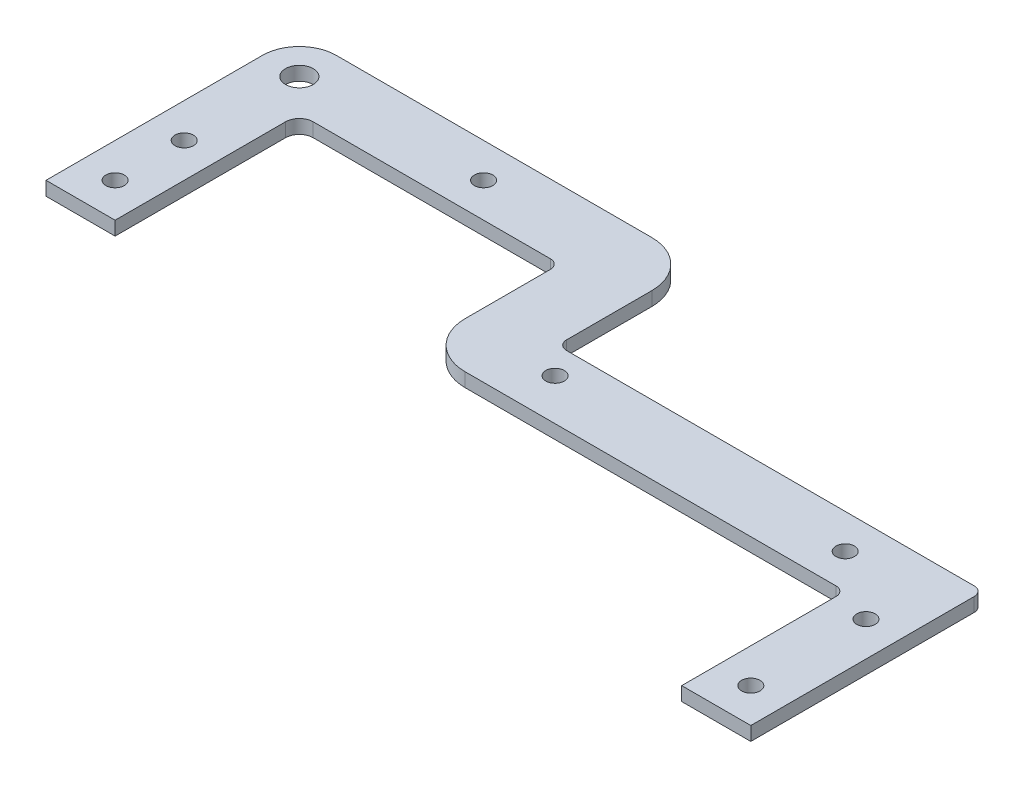
ISO-10303-21;
HEADER;
FILE_DESCRIPTION(('STEP AP214'),'2;1');
FILE_NAME('part.step','',(''),(''),'','','');
FILE_SCHEMA(('AUTOMOTIVE_DESIGN { 1 0 10303 214 1 1 1 1 }'));
ENDSEC;
DATA;
#1=APPLICATION_CONTEXT('core data for automotive mechanical design processes');
#2=APPLICATION_PROTOCOL_DEFINITION('international standard','automotive_design',2000,#1);
#3=PRODUCT_CONTEXT('',#1,'mechanical');
#4=PRODUCT('Part','Part','',(#3));
#5=PRODUCT_RELATED_PRODUCT_CATEGORY('part','',(#4));
#6=PRODUCT_DEFINITION_FORMATION('','',#4);
#7=PRODUCT_DEFINITION_CONTEXT('part definition',#1,'design');
#8=PRODUCT_DEFINITION('design','',#6,#7);
#9=PRODUCT_DEFINITION_SHAPE('','',#8);
#10=(LENGTH_UNIT() NAMED_UNIT(*) SI_UNIT(.MILLI.,.METRE.));
#11=(NAMED_UNIT(*) PLANE_ANGLE_UNIT() SI_UNIT($,.RADIAN.));
#12=(NAMED_UNIT(*) SI_UNIT($,.STERADIAN.) SOLID_ANGLE_UNIT());
#13=UNCERTAINTY_MEASURE_WITH_UNIT(LENGTH_MEASURE(1.E-05),#10,'distance_accuracy_value','');
#14=(GEOMETRIC_REPRESENTATION_CONTEXT(3) GLOBAL_UNCERTAINTY_ASSIGNED_CONTEXT((#13)) GLOBAL_UNIT_ASSIGNED_CONTEXT((#10,
#11,#12)) REPRESENTATION_CONTEXT('',''));
#15=CARTESIAN_POINT('',(0.,0.,0.));
#16=DIRECTION('',(0.,0.,1.));
#17=DIRECTION('',(1.,0.,0.));
#18=AXIS2_PLACEMENT_3D('',#15,#16,#17);
#19=CARTESIAN_POINT('',(-132.5,3.,-50.5));
#20=DIRECTION('',(0.,0.,1.));
#21=DIRECTION('',(1.,0.,0.));
#22=AXIS2_PLACEMENT_3D('',#19,#20,#21);
#23=PLANE('',#22);
#24=DIRECTION('',(-1.,0.,0.));
#25=VECTOR('',#24,1.);
#26=CARTESIAN_POINT('',(-132.5,0.,-50.5));
#27=LINE('',#26,#25);
#28=CARTESIAN_POINT('',(-42.,0.,-50.5));
#29=VERTEX_POINT('',#28);
#30=CARTESIAN_POINT('',(-130.5,0.,-50.5));
#31=VERTEX_POINT('',#30);
#32=EDGE_CURVE('E315',#29,#31,#27,.T.);
#33=ORIENTED_EDGE('',*,*,#32,.T.);
#34=DIRECTION('',(0.,-1.,0.));
#35=VECTOR('',#34,1.);
#36=CARTESIAN_POINT('',(-130.5,3.,-50.5));
#37=LINE('',#36,#35);
#38=CARTESIAN_POINT('',(-130.5,3.,-50.5));
#39=VERTEX_POINT('',#38);
#40=EDGE_CURVE('E259',#31,#39,#37,.F.);
#41=ORIENTED_EDGE('',*,*,#40,.T.);
#42=DIRECTION('',(-1.,0.,0.));
#43=VECTOR('',#42,1.);
#44=CARTESIAN_POINT('',(-132.5,3.,-50.5));
#45=LINE('',#44,#43);
#46=CARTESIAN_POINT('',(-42.,3.,-50.5));
#47=VERTEX_POINT('',#46);
#48=EDGE_CURVE('E277',#47,#39,#45,.T.);
#49=ORIENTED_EDGE('',*,*,#48,.F.);
#50=DIRECTION('',(0.,-1.,0.));
#51=VECTOR('',#50,1.);
#52=CARTESIAN_POINT('',(-42.,3.,-50.5));
#53=LINE('',#52,#51);
#54=EDGE_CURVE('E256',#47,#29,#53,.T.);
#55=ORIENTED_EDGE('',*,*,#54,.T.);
#56=EDGE_LOOP('',(#33,#41,#49,#55));
#57=FACE_BOUND('',#56,.T.);
#58=ADVANCED_FACE('F42',(#57),#23,.F.);
#59=CARTESIAN_POINT('',(-132.5,3.,-50.5));
#60=DIRECTION('',(-1.,0.,0.));
#61=DIRECTION('',(0.,0.,1.));
#62=AXIS2_PLACEMENT_3D('',#59,#60,#61);
#63=PLANE('',#62);
#64=DIRECTION('',(0.,0.,-1.));
#65=VECTOR('',#64,1.);
#66=CARTESIAN_POINT('',(-132.5,3.,-50.5));
#67=LINE('',#66,#65);
#68=CARTESIAN_POINT('',(-132.5,3.,-52.5));
#69=VERTEX_POINT('',#68);
#70=CARTESIAN_POINT('',(-132.5,3.,-71.));
#71=VERTEX_POINT('',#70);
#72=EDGE_CURVE('E190',#69,#71,#67,.T.);
#73=ORIENTED_EDGE('',*,*,#72,.F.);
#74=DIRECTION('',(0.,-1.,0.));
#75=VECTOR('',#74,1.);
#76=CARTESIAN_POINT('',(-132.5,0.,-52.5));
#77=LINE('',#76,#75);
#78=CARTESIAN_POINT('',(-132.5,0.,-52.5));
#79=VERTEX_POINT('',#78);
#80=EDGE_CURVE('E253',#69,#79,#77,.T.);
#81=ORIENTED_EDGE('',*,*,#80,.T.);
#82=DIRECTION('',(0.,0.,-1.));
#83=VECTOR('',#82,1.);
#84=CARTESIAN_POINT('',(-132.5,0.,-50.5));
#85=LINE('',#84,#83);
#86=CARTESIAN_POINT('',(-132.5,0.,-71.));
#87=VERTEX_POINT('',#86);
#88=EDGE_CURVE('E294',#79,#87,#85,.T.);
#89=ORIENTED_EDGE('',*,*,#88,.T.);
#90=DIRECTION('',(0.,-1.,0.));
#91=VECTOR('',#90,1.);
#92=CARTESIAN_POINT('',(-132.5,3.,-71.));
#93=LINE('',#92,#91);
#94=EDGE_CURVE('E244',#87,#71,#93,.F.);
#95=ORIENTED_EDGE('',*,*,#94,.T.);
#96=EDGE_LOOP('',(#73,#81,#89,#95));
#97=FACE_BOUND('',#96,.T.);
#98=ADVANCED_FACE('F292',(#97),#63,.F.);
#99=CARTESIAN_POINT('',(-211.,3.,-81.));
#100=DIRECTION('',(0.,0.,1.));
#101=DIRECTION('',(1.,0.,0.));
#102=AXIS2_PLACEMENT_3D('',#99,#100,#101);
#103=PLANE('',#102);
#104=DIRECTION('',(-1.,0.,0.));
#105=VECTOR('',#104,1.);
#106=CARTESIAN_POINT('',(-211.,3.,-81.));
#107=LINE('',#106,#105);
#108=CARTESIAN_POINT('',(-142.5,3.,-81.));
#109=VERTEX_POINT('',#108);
#110=CARTESIAN_POINT('',(-211.,3.,-81.));
#111=VERTEX_POINT('',#110);
#112=EDGE_CURVE('E178',#109,#111,#107,.T.);
#113=ORIENTED_EDGE('',*,*,#112,.F.);
#114=DIRECTION('',(0.,-1.,0.));
#115=VECTOR('',#114,1.);
#116=CARTESIAN_POINT('',(-142.5,3.,-81.));
#117=LINE('',#116,#115);
#118=CARTESIAN_POINT('',(-142.5,0.,-81.));
#119=VERTEX_POINT('',#118);
#120=EDGE_CURVE('E240',#109,#119,#117,.T.);
#121=ORIENTED_EDGE('',*,*,#120,.T.);
#122=DIRECTION('',(-1.,0.,0.));
#123=VECTOR('',#122,1.);
#124=CARTESIAN_POINT('',(-211.,0.,-81.));
#125=LINE('',#124,#123);
#126=CARTESIAN_POINT('',(-211.,0.,-81.));
#127=VERTEX_POINT('',#126);
#128=EDGE_CURVE('E196',#119,#127,#125,.T.);
#129=ORIENTED_EDGE('',*,*,#128,.T.);
#130=DIRECTION('',(0.,-1.,0.));
#131=VECTOR('',#130,1.);
#132=CARTESIAN_POINT('',(-211.,3.,-81.));
#133=LINE('',#132,#131);
#134=EDGE_CURVE('E193',#111,#127,#133,.T.);
#135=ORIENTED_EDGE('',*,*,#134,.F.);
#136=EDGE_LOOP('',(#113,#121,#129,#135));
#137=FACE_BOUND('',#136,.T.);
#138=ADVANCED_FACE('F194',(#137),#103,.F.);
#139=CARTESIAN_POINT('',(-211.,3.,-73.));
#140=DIRECTION('',(0.,-1.,0.));
#141=DIRECTION('',(0.,0.,-1.));
#142=AXIS2_PLACEMENT_3D('',#139,#140,#141);
#143=CYLINDRICAL_SURFACE('',#142,8.00000000000001);
#144=CARTESIAN_POINT('',(-211.,0.,-73.));
#145=DIRECTION('',(0.,1.,0.));
#146=DIRECTION('',(0.,0.,1.));
#147=AXIS2_PLACEMENT_3D('',#144,#145,#146);
#148=CIRCLE('',#147,8.00000000000001);
#149=CARTESIAN_POINT('',(-219.,0.,-73.));
#150=VERTEX_POINT('',#149);
#151=EDGE_CURVE('E370',#127,#150,#148,.T.);
#152=ORIENTED_EDGE('',*,*,#151,.T.);
#153=DIRECTION('',(0.,-1.,0.));
#154=VECTOR('',#153,1.);
#155=CARTESIAN_POINT('',(-219.,3.,-73.));
#156=LINE('',#155,#154);
#157=CARTESIAN_POINT('',(-219.,3.,-73.));
#158=VERTEX_POINT('',#157);
#159=EDGE_CURVE('E200',#158,#150,#156,.T.);
#160=ORIENTED_EDGE('',*,*,#159,.F.);
#161=CARTESIAN_POINT('',(-211.,3.,-73.));
#162=DIRECTION('',(0.,1.,0.));
#163=DIRECTION('',(0.,0.,1.));
#164=AXIS2_PLACEMENT_3D('',#161,#162,#163);
#165=CIRCLE('',#164,8.00000000000001);
#166=EDGE_CURVE('E183',#111,#158,#165,.T.);
#167=ORIENTED_EDGE('',*,*,#166,.F.);
#168=ORIENTED_EDGE('',*,*,#134,.T.);
#169=EDGE_LOOP('',(#152,#160,#167,#168));
#170=FACE_BOUND('',#169,.T.);
#171=ADVANCED_FACE('F202',(#170),#143,.T.);
#172=CARTESIAN_POINT('',(-219.,3.,-73.));
#173=DIRECTION('',(1.,0.,0.));
#174=DIRECTION('',(0.,0.,-1.));
#175=AXIS2_PLACEMENT_3D('',#172,#173,#174);
#176=PLANE('',#175);
#177=DIRECTION('',(0.,0.,1.));
#178=VECTOR('',#177,1.);
#179=CARTESIAN_POINT('',(-219.,0.,-73.));
#180=LINE('',#179,#178);
#181=CARTESIAN_POINT('',(-219.,0.,-26.));
#182=VERTEX_POINT('',#181);
#183=EDGE_CURVE('E368',#150,#182,#180,.T.);
#184=ORIENTED_EDGE('',*,*,#183,.T.);
#185=DIRECTION('',(0.,-1.,0.));
#186=VECTOR('',#185,1.);
#187=CARTESIAN_POINT('',(-219.,3.,-26.));
#188=LINE('',#187,#186);
#189=CARTESIAN_POINT('',(-219.,3.,-26.));
#190=VERTEX_POINT('',#189);
#191=EDGE_CURVE('E338',#190,#182,#188,.T.);
#192=ORIENTED_EDGE('',*,*,#191,.F.);
#193=DIRECTION('',(0.,0.,1.));
#194=VECTOR('',#193,1.);
#195=CARTESIAN_POINT('',(-219.,3.,-73.));
#196=LINE('',#195,#194);
#197=EDGE_CURVE('E205',#158,#190,#196,.T.);
#198=ORIENTED_EDGE('',*,*,#197,.F.);
#199=ORIENTED_EDGE('',*,*,#159,.T.);
#200=EDGE_LOOP('',(#184,#192,#198,#199));
#201=FACE_BOUND('',#200,.T.);
#202=ADVANCED_FACE('F489',(#201),#176,.F.);
#203=CARTESIAN_POINT('',(-219.,3.,-26.));
#204=DIRECTION('',(0.,0.,-1.));
#205=DIRECTION('',(-1.,0.,0.));
#206=AXIS2_PLACEMENT_3D('',#203,#204,#205);
#207=PLANE('',#206);
#208=DIRECTION('',(1.,0.,0.));
#209=VECTOR('',#208,1.);
#210=CARTESIAN_POINT('',(-219.,0.,-26.));
#211=LINE('',#210,#209);
#212=CARTESIAN_POINT('',(-204.,0.,-26.));
#213=VERTEX_POINT('',#212);
#214=EDGE_CURVE('E366',#182,#213,#211,.T.);
#215=ORIENTED_EDGE('',*,*,#214,.T.);
#216=DIRECTION('',(0.,-1.,0.));
#217=VECTOR('',#216,1.);
#218=CARTESIAN_POINT('',(-204.,3.,-26.));
#219=LINE('',#218,#217);
#220=CARTESIAN_POINT('',(-204.,3.,-26.));
#221=VERTEX_POINT('',#220);
#222=EDGE_CURVE('E341',#221,#213,#219,.T.);
#223=ORIENTED_EDGE('',*,*,#222,.F.);
#224=DIRECTION('',(1.,0.,0.));
#225=VECTOR('',#224,1.);
#226=CARTESIAN_POINT('',(-219.,3.,-26.));
#227=LINE('',#226,#225);
#228=EDGE_CURVE('E207',#190,#221,#227,.T.);
#229=ORIENTED_EDGE('',*,*,#228,.F.);
#230=ORIENTED_EDGE('',*,*,#191,.T.);
#231=EDGE_LOOP('',(#215,#223,#229,#230));
#232=FACE_BOUND('',#231,.T.);
#233=ADVANCED_FACE('F494',(#232),#207,.F.);
#234=CARTESIAN_POINT('',(-204.,3.,-26.));
#235=DIRECTION('',(-1.,0.,0.));
#236=DIRECTION('',(0.,0.,1.));
#237=AXIS2_PLACEMENT_3D('',#234,#235,#236);
#238=PLANE('',#237);
#239=DIRECTION('',(0.,0.,-1.));
#240=VECTOR('',#239,1.);
#241=CARTESIAN_POINT('',(-204.,0.,-26.));
#242=LINE('',#241,#240);
#243=CARTESIAN_POINT('',(-204.,0.,-63.));
#244=VERTEX_POINT('',#243);
#245=EDGE_CURVE('E364',#213,#244,#242,.T.);
#246=ORIENTED_EDGE('',*,*,#245,.T.);
#247=DIRECTION('',(0.,-1.,0.));
#248=VECTOR('',#247,1.);
#249=CARTESIAN_POINT('',(-204.,3.,-63.));
#250=LINE('',#249,#248);
#251=CARTESIAN_POINT('',(-204.,3.,-63.));
#252=VERTEX_POINT('',#251);
#253=EDGE_CURVE('E57',#244,#252,#250,.F.);
#254=ORIENTED_EDGE('',*,*,#253,.T.);
#255=DIRECTION('',(0.,0.,-1.));
#256=VECTOR('',#255,1.);
#257=CARTESIAN_POINT('',(-204.,3.,-26.));
#258=LINE('',#257,#256);
#259=EDGE_CURVE('E223',#221,#252,#258,.T.);
#260=ORIENTED_EDGE('',*,*,#259,.F.);
#261=ORIENTED_EDGE('',*,*,#222,.T.);
#262=EDGE_LOOP('',(#246,#254,#260,#261));
#263=FACE_BOUND('',#262,.T.);
#264=ADVANCED_FACE('F495',(#263),#238,.F.);
#265=CARTESIAN_POINT('',(-204.,3.,-66.));
#266=DIRECTION('',(0.,0.,-1.));
#267=DIRECTION('',(-1.,0.,0.));
#268=AXIS2_PLACEMENT_3D('',#265,#266,#267);
#269=PLANE('',#268);
#270=DIRECTION('',(1.,0.,0.));
#271=VECTOR('',#270,1.);
#272=CARTESIAN_POINT('',(-204.,3.,-66.));
#273=LINE('',#272,#271);
#274=CARTESIAN_POINT('',(-201.,3.,-66.));
#275=VERTEX_POINT('',#274);
#276=CARTESIAN_POINT('',(-149.5,3.,-66.));
#277=VERTEX_POINT('',#276);
#278=EDGE_CURVE('E226',#275,#277,#273,.T.);
#279=ORIENTED_EDGE('',*,*,#278,.F.);
#280=DIRECTION('',(0.,-1.,0.));
#281=VECTOR('',#280,1.);
#282=CARTESIAN_POINT('',(-201.,0.,-66.));
#283=LINE('',#282,#281);
#284=CARTESIAN_POINT('',(-201.,0.,-66.));
#285=VERTEX_POINT('',#284);
#286=EDGE_CURVE('E407',#275,#285,#283,.T.);
#287=ORIENTED_EDGE('',*,*,#286,.T.);
#288=DIRECTION('',(1.,0.,0.));
#289=VECTOR('',#288,1.);
#290=CARTESIAN_POINT('',(-204.,0.,-66.));
#291=LINE('',#290,#289);
#292=CARTESIAN_POINT('',(-149.5,0.,-66.));
#293=VERTEX_POINT('',#292);
#294=EDGE_CURVE('E362',#285,#293,#291,.T.);
#295=ORIENTED_EDGE('',*,*,#294,.T.);
#296=DIRECTION('',(0.,-1.,0.));
#297=VECTOR('',#296,1.);
#298=CARTESIAN_POINT('',(-149.5,3.,-66.));
#299=LINE('',#298,#297);
#300=EDGE_CURVE('E250',#293,#277,#299,.F.);
#301=ORIENTED_EDGE('',*,*,#300,.T.);
#302=EDGE_LOOP('',(#279,#287,#295,#301));
#303=FACE_BOUND('',#302,.T.);
#304=ADVANCED_FACE('F413',(#303),#269,.F.);
#305=CARTESIAN_POINT('',(-147.5,3.,-66.));
#306=DIRECTION('',(1.,0.,0.));
#307=DIRECTION('',(0.,0.,-1.));
#308=AXIS2_PLACEMENT_3D('',#305,#306,#307);
#309=PLANE('',#308);
#310=DIRECTION('',(0.,0.,1.));
#311=VECTOR('',#310,1.);
#312=CARTESIAN_POINT('',(-147.5,3.,-66.));
#313=LINE('',#312,#311);
#314=CARTESIAN_POINT('',(-147.5,3.,-64.));
#315=VERTEX_POINT('',#314);
#316=CARTESIAN_POINT('',(-147.5,3.,-45.5000000000002));
#317=VERTEX_POINT('',#316);
#318=EDGE_CURVE('E229',#315,#317,#313,.T.);
#319=ORIENTED_EDGE('',*,*,#318,.F.);
#320=DIRECTION('',(0.,-1.,0.));
#321=VECTOR('',#320,1.);
#322=CARTESIAN_POINT('',(-147.5,0.,-64.));
#323=LINE('',#322,#321);
#324=CARTESIAN_POINT('',(-147.5,0.,-64.));
#325=VERTEX_POINT('',#324);
#326=EDGE_CURVE('E247',#315,#325,#323,.T.);
#327=ORIENTED_EDGE('',*,*,#326,.T.);
#328=DIRECTION('',(0.,0.,1.));
#329=VECTOR('',#328,1.);
#330=CARTESIAN_POINT('',(-147.5,0.,-66.));
#331=LINE('',#330,#329);
#332=CARTESIAN_POINT('',(-147.5,0.,-45.5000000000002));
#333=VERTEX_POINT('',#332);
#334=EDGE_CURVE('E360',#325,#333,#331,.T.);
#335=ORIENTED_EDGE('',*,*,#334,.T.);
#336=DIRECTION('',(0.,-1.,0.));
#337=VECTOR('',#336,1.);
#338=CARTESIAN_POINT('',(-147.5,3.,-45.5000000000002));
#339=LINE('',#338,#337);
#340=EDGE_CURVE('E298',#333,#317,#339,.F.);
#341=ORIENTED_EDGE('',*,*,#340,.T.);
#342=EDGE_LOOP('',(#319,#327,#335,#341));
#343=FACE_BOUND('',#342,.T.);
#344=ADVANCED_FACE('F389',(#343),#309,.F.);
#345=CARTESIAN_POINT('',(-147.5,3.,-35.5000000000002));
#346=DIRECTION('',(0.,0.,-1.));
#347=DIRECTION('',(-1.,0.,0.));
#348=AXIS2_PLACEMENT_3D('',#345,#346,#347);
#349=PLANE('',#348);
#350=DIRECTION('',(1.,0.,0.));
#351=VECTOR('',#350,1.);
#352=CARTESIAN_POINT('',(-147.5,0.,-35.5000000000002));
#353=LINE('',#352,#351);
#354=CARTESIAN_POINT('',(-137.5,0.,-35.5000000000002));
#355=VERTEX_POINT('',#354);
#356=CARTESIAN_POINT('',(-57.,0.,-35.5000000000002));
#357=VERTEX_POINT('',#356);
#358=EDGE_CURVE('E357',#355,#357,#353,.T.);
#359=ORIENTED_EDGE('',*,*,#358,.T.);
#360=DIRECTION('',(0.,-1.,0.));
#361=VECTOR('',#360,1.);
#362=CARTESIAN_POINT('',(-57.,3.,-35.5000000000002));
#363=LINE('',#362,#361);
#364=CARTESIAN_POINT('',(-57.,3.,-35.5000000000002));
#365=VERTEX_POINT('',#364);
#366=EDGE_CURVE('E396',#357,#365,#363,.F.);
#367=ORIENTED_EDGE('',*,*,#366,.T.);
#368=DIRECTION('',(1.,0.,0.));
#369=VECTOR('',#368,1.);
#370=CARTESIAN_POINT('',(-147.5,3.,-35.5000000000002));
#371=LINE('',#370,#369);
#372=CARTESIAN_POINT('',(-137.5,3.,-35.5000000000002));
#373=VERTEX_POINT('',#372);
#374=EDGE_CURVE('E381',#373,#365,#371,.T.);
#375=ORIENTED_EDGE('',*,*,#374,.F.);
#376=DIRECTION('',(0.,-1.,0.));
#377=VECTOR('',#376,1.);
#378=CARTESIAN_POINT('',(-137.5,3.,-35.5000000000002));
#379=LINE('',#378,#377);
#380=EDGE_CURVE('E199',#373,#355,#379,.T.);
#381=ORIENTED_EDGE('',*,*,#380,.T.);
#382=EDGE_LOOP('',(#359,#367,#375,#381));
#383=FACE_BOUND('',#382,.T.);
#384=ADVANCED_FACE('F556',(#383),#349,.F.);
#385=CARTESIAN_POINT('',(-55.,3.,0.));
#386=DIRECTION('',(1.,0.,0.));
#387=DIRECTION('',(0.,0.,-1.));
#388=AXIS2_PLACEMENT_3D('',#385,#386,#387);
#389=PLANE('',#388);
#390=DIRECTION('',(0.,0.,1.));
#391=VECTOR('',#390,1.);
#392=CARTESIAN_POINT('',(-55.,3.,0.));
#393=LINE('',#392,#391);
#394=CARTESIAN_POINT('',(-55.,3.,-33.5000000000002));
#395=VERTEX_POINT('',#394);
#396=CARTESIAN_POINT('',(-55.,3.,0.));
#397=VERTEX_POINT('',#396);
#398=EDGE_CURVE('E379',#395,#397,#393,.T.);
#399=ORIENTED_EDGE('',*,*,#398,.F.);
#400=DIRECTION('',(0.,-1.,0.));
#401=VECTOR('',#400,1.);
#402=CARTESIAN_POINT('',(-55.,0.,-33.5000000000002));
#403=LINE('',#402,#401);
#404=CARTESIAN_POINT('',(-55.,0.,-33.5000000000002));
#405=VERTEX_POINT('',#404);
#406=EDGE_CURVE('E268',#395,#405,#403,.T.);
#407=ORIENTED_EDGE('',*,*,#406,.T.);
#408=DIRECTION('',(0.,0.,1.));
#409=VECTOR('',#408,1.);
#410=CARTESIAN_POINT('',(-55.,0.,0.));
#411=LINE('',#410,#409);
#412=CARTESIAN_POINT('',(-55.,0.,0.));
#413=VERTEX_POINT('',#412);
#414=EDGE_CURVE('E355',#405,#413,#411,.T.);
#415=ORIENTED_EDGE('',*,*,#414,.T.);
#416=DIRECTION('',(0.,-1.,0.));
#417=VECTOR('',#416,1.);
#418=CARTESIAN_POINT('',(-55.,3.,0.));
#419=LINE('',#418,#417);
#420=EDGE_CURVE('E344',#397,#413,#419,.T.);
#421=ORIENTED_EDGE('',*,*,#420,.F.);
#422=EDGE_LOOP('',(#399,#407,#415,#421));
#423=FACE_BOUND('',#422,.T.);
#424=ADVANCED_FACE('F472',(#423),#389,.F.);
#425=CARTESIAN_POINT('',(-55.,3.,0.));
#426=DIRECTION('',(0.,0.,-1.));
#427=DIRECTION('',(-1.,0.,0.));
#428=AXIS2_PLACEMENT_3D('',#425,#426,#427);
#429=PLANE('',#428);
#430=DIRECTION('',(1.,0.,0.));
#431=VECTOR('',#430,1.);
#432=CARTESIAN_POINT('',(-55.,0.,0.));
#433=LINE('',#432,#431);
#434=CARTESIAN_POINT('',(-40.,0.,0.));
#435=VERTEX_POINT('',#434);
#436=EDGE_CURVE('E353',#413,#435,#433,.T.);
#437=ORIENTED_EDGE('',*,*,#436,.T.);
#438=DIRECTION('',(0.,-1.,0.));
#439=VECTOR('',#438,1.);
#440=CARTESIAN_POINT('',(-40.,3.,0.));
#441=LINE('',#440,#439);
#442=CARTESIAN_POINT('',(-40.,3.,0.));
#443=VERTEX_POINT('',#442);
#444=EDGE_CURVE('E347',#443,#435,#441,.T.);
#445=ORIENTED_EDGE('',*,*,#444,.F.);
#446=DIRECTION('',(1.,0.,0.));
#447=VECTOR('',#446,1.);
#448=CARTESIAN_POINT('',(-55.,3.,0.));
#449=LINE('',#448,#447);
#450=EDGE_CURVE('E376',#397,#443,#449,.T.);
#451=ORIENTED_EDGE('',*,*,#450,.F.);
#452=ORIENTED_EDGE('',*,*,#420,.T.);
#453=EDGE_LOOP('',(#437,#445,#451,#452));
#454=FACE_BOUND('',#453,.T.);
#455=ADVANCED_FACE('F478',(#454),#429,.F.);
#456=CARTESIAN_POINT('',(-40.,3.,0.));
#457=DIRECTION('',(-1.,0.,0.));
#458=DIRECTION('',(0.,0.,1.));
#459=AXIS2_PLACEMENT_3D('',#456,#457,#458);
#460=PLANE('',#459);
#461=DIRECTION('',(0.,0.,-1.));
#462=VECTOR('',#461,1.);
#463=CARTESIAN_POINT('',(-40.,0.,0.));
#464=LINE('',#463,#462);
#465=CARTESIAN_POINT('',(-40.,0.,-48.5));
#466=VERTEX_POINT('',#465);
#467=EDGE_CURVE('E281',#435,#466,#464,.T.);
#468=ORIENTED_EDGE('',*,*,#467,.T.);
#469=DIRECTION('',(0.,-1.,0.));
#470=VECTOR('',#469,1.);
#471=CARTESIAN_POINT('',(-40.,3.,-48.5));
#472=LINE('',#471,#470);
#473=CARTESIAN_POINT('',(-40.,3.,-48.5));
#474=VERTEX_POINT('',#473);
#475=EDGE_CURVE('E263',#466,#474,#472,.F.);
#476=ORIENTED_EDGE('',*,*,#475,.T.);
#477=DIRECTION('',(0.,0.,-1.));
#478=VECTOR('',#477,1.);
#479=CARTESIAN_POINT('',(-40.,3.,0.));
#480=LINE('',#479,#478);
#481=EDGE_CURVE('E350',#443,#474,#480,.T.);
#482=ORIENTED_EDGE('',*,*,#481,.F.);
#483=ORIENTED_EDGE('',*,*,#444,.T.);
#484=EDGE_LOOP('',(#468,#476,#482,#483));
#485=FACE_BOUND('',#484,.T.);
#486=ADVANCED_FACE('F430',(#485),#460,.F.);
#487=CARTESIAN_POINT('',(-211.,3.,-73.));
#488=DIRECTION('',(0.,1.,0.));
#489=DIRECTION('',(0.,0.,1.));
#490=AXIS2_PLACEMENT_3D('',#487,#488,#489);
#491=PLANE('',#490);
#492=CARTESIAN_POINT('',(-47.5,3.,-7.5));
#493=DIRECTION('',(0.,1.,0.));
#494=DIRECTION('',(0.,0.,1.));
#495=AXIS2_PLACEMENT_3D('',#492,#493,#494);
#496=CIRCLE('',#495,2.);
#497=CARTESIAN_POINT('',(-47.5,3.,-5.5));
#498=VERTEX_POINT('',#497);
#499=EDGE_CURVE('E655',#498,#498,#496,.T.);
#500=ORIENTED_EDGE('',*,*,#499,.F.);
#501=EDGE_LOOP('',(#500));
#502=FACE_BOUND('',#501,.T.);
#503=CARTESIAN_POINT('',(-211.5,3.,-33.5));
#504=DIRECTION('',(0.,1.,0.));
#505=DIRECTION('',(0.,0.,1.));
#506=AXIS2_PLACEMENT_3D('',#503,#504,#505);
#507=CIRCLE('',#506,2.);
#508=CARTESIAN_POINT('',(-211.5,3.,-31.5));
#509=VERTEX_POINT('',#508);
#510=EDGE_CURVE('E657',#509,#509,#507,.T.);
#511=ORIENTED_EDGE('',*,*,#510,.F.);
#512=EDGE_LOOP('',(#511));
#513=FACE_BOUND('',#512,.T.);
#514=CARTESIAN_POINT('',(-211.5,3.,-48.5));
#515=DIRECTION('',(0.,1.,0.));
#516=DIRECTION('',(0.,0.,1.));
#517=AXIS2_PLACEMENT_3D('',#514,#515,#516);
#518=CIRCLE('',#517,2.);
#519=CARTESIAN_POINT('',(-211.5,3.,-46.5));
#520=VERTEX_POINT('',#519);
#521=EDGE_CURVE('E661',#520,#520,#518,.T.);
#522=ORIENTED_EDGE('',*,*,#521,.F.);
#523=EDGE_LOOP('',(#522));
#524=FACE_BOUND('',#523,.T.);
#525=CARTESIAN_POINT('',(-211.,3.,-73.));
#526=DIRECTION('',(0.,1.,0.));
#527=DIRECTION('',(0.,0.,1.));
#528=AXIS2_PLACEMENT_3D('',#525,#526,#527);
#529=CIRCLE('',#528,2.99999999999999);
#530=CARTESIAN_POINT('',(-211.,3.,-70.));
#531=VERTEX_POINT('',#530);
#532=EDGE_CURVE('E677',#531,#531,#529,.T.);
#533=ORIENTED_EDGE('',*,*,#532,.F.);
#534=EDGE_LOOP('',(#533));
#535=FACE_BOUND('',#534,.T.);
#536=CARTESIAN_POINT('',(-171.5,3.,-73.5));
#537=DIRECTION('',(0.,1.,0.));
#538=DIRECTION('',(0.,0.,1.));
#539=AXIS2_PLACEMENT_3D('',#536,#537,#538);
#540=CIRCLE('',#539,2.);
#541=CARTESIAN_POINT('',(-171.5,3.,-71.5));
#542=VERTEX_POINT('',#541);
#543=EDGE_CURVE('E680',#542,#542,#540,.T.);
#544=ORIENTED_EDGE('',*,*,#543,.F.);
#545=EDGE_LOOP('',(#544));
#546=FACE_BOUND('',#545,.T.);
#547=CARTESIAN_POINT('',(-127.,3.,-44.5));
#548=DIRECTION('',(0.,1.,0.));
#549=DIRECTION('',(0.,0.,1.));
#550=AXIS2_PLACEMENT_3D('',#547,#548,#549);
#551=CIRCLE('',#550,2.);
#552=CARTESIAN_POINT('',(-127.,3.,-42.5));
#553=VERTEX_POINT('',#552);
#554=EDGE_CURVE('E683',#553,#553,#551,.T.);
#555=ORIENTED_EDGE('',*,*,#554,.F.);
#556=EDGE_LOOP('',(#555));
#557=FACE_BOUND('',#556,.T.);
#558=CARTESIAN_POINT('',(-62.5,3.,-43.));
#559=DIRECTION('',(0.,1.,0.));
#560=DIRECTION('',(0.,0.,1.));
#561=AXIS2_PLACEMENT_3D('',#558,#559,#560);
#562=CIRCLE('',#561,2.);
#563=CARTESIAN_POINT('',(-62.5,3.,-41.));
#564=VERTEX_POINT('',#563);
#565=EDGE_CURVE('E665',#564,#564,#562,.T.);
#566=ORIENTED_EDGE('',*,*,#565,.F.);
#567=EDGE_LOOP('',(#566));
#568=FACE_BOUND('',#567,.T.);
#569=CARTESIAN_POINT('',(-47.5,3.,-32.5));
#570=DIRECTION('',(0.,1.,0.));
#571=DIRECTION('',(0.,0.,1.));
#572=AXIS2_PLACEMENT_3D('',#569,#570,#571);
#573=CIRCLE('',#572,2.);
#574=CARTESIAN_POINT('',(-47.5,3.,-30.5));
#575=VERTEX_POINT('',#574);
#576=EDGE_CURVE('E282',#575,#575,#573,.T.);
#577=ORIENTED_EDGE('',*,*,#576,.F.);
#578=EDGE_LOOP('',(#577));
#579=FACE_BOUND('',#578,.T.);
#580=ORIENTED_EDGE('',*,*,#481,.T.);
#581=CARTESIAN_POINT('',(-42.,3.,-48.5));
#582=DIRECTION('',(0.,1.,0.));
#583=DIRECTION('',(0.,0.,1.));
#584=AXIS2_PLACEMENT_3D('',#581,#582,#583);
#585=CIRCLE('',#584,2.);
#586=EDGE_CURVE('E265',#474,#47,#585,.T.);
#587=ORIENTED_EDGE('',*,*,#586,.T.);
#588=ORIENTED_EDGE('',*,*,#48,.T.);
#589=CARTESIAN_POINT('',(-130.5,3.,-52.5));
#590=DIRECTION('',(0.,1.,0.));
#591=DIRECTION('',(0.,0.,1.));
#592=AXIS2_PLACEMENT_3D('',#589,#590,#591);
#593=CIRCLE('',#592,2.);
#594=EDGE_CURVE('E288',#39,#69,#593,.F.);
#595=ORIENTED_EDGE('',*,*,#594,.T.);
#596=ORIENTED_EDGE('',*,*,#72,.T.);
#597=CARTESIAN_POINT('',(-142.5,3.,-71.));
#598=DIRECTION('',(0.,1.,0.));
#599=DIRECTION('',(0.,0.,1.));
#600=AXIS2_PLACEMENT_3D('',#597,#598,#599);
#601=CIRCLE('',#600,10.);
#602=EDGE_CURVE('E186',#71,#109,#601,.T.);
#603=ORIENTED_EDGE('',*,*,#602,.T.);
#604=ORIENTED_EDGE('',*,*,#112,.T.);
#605=ORIENTED_EDGE('',*,*,#166,.T.);
#606=ORIENTED_EDGE('',*,*,#197,.T.);
#607=ORIENTED_EDGE('',*,*,#228,.T.);
#608=ORIENTED_EDGE('',*,*,#259,.T.);
#609=CARTESIAN_POINT('',(-201.,3.,-63.));
#610=DIRECTION('',(0.,1.,0.));
#611=DIRECTION('',(0.,0.,1.));
#612=AXIS2_PLACEMENT_3D('',#609,#610,#611);
#613=CIRCLE('',#612,3.);
#614=EDGE_CURVE('E12',#252,#275,#613,.F.);
#615=ORIENTED_EDGE('',*,*,#614,.T.);
#616=ORIENTED_EDGE('',*,*,#278,.T.);
#617=CARTESIAN_POINT('',(-149.5,3.,-64.));
#618=DIRECTION('',(0.,1.,0.));
#619=DIRECTION('',(0.,0.,1.));
#620=AXIS2_PLACEMENT_3D('',#617,#618,#619);
#621=CIRCLE('',#620,2.);
#622=EDGE_CURVE('E387',#277,#315,#621,.F.);
#623=ORIENTED_EDGE('',*,*,#622,.T.);
#624=ORIENTED_EDGE('',*,*,#318,.T.);
#625=CARTESIAN_POINT('',(-137.5,3.,-45.5000000000002));
#626=DIRECTION('',(0.,1.,0.));
#627=DIRECTION('',(0.,0.,1.));
#628=AXIS2_PLACEMENT_3D('',#625,#626,#627);
#629=CIRCLE('',#628,10.);
#630=EDGE_CURVE('E236',#317,#373,#629,.T.);
#631=ORIENTED_EDGE('',*,*,#630,.T.);
#632=ORIENTED_EDGE('',*,*,#374,.T.);
#633=CARTESIAN_POINT('',(-57.,3.,-33.5000000000002));
#634=DIRECTION('',(0.,1.,0.));
#635=DIRECTION('',(0.,0.,1.));
#636=AXIS2_PLACEMENT_3D('',#633,#634,#635);
#637=CIRCLE('',#636,2.);
#638=EDGE_CURVE('E405',#365,#395,#637,.F.);
#639=ORIENTED_EDGE('',*,*,#638,.T.);
#640=ORIENTED_EDGE('',*,*,#398,.T.);
#641=ORIENTED_EDGE('',*,*,#450,.T.);
#642=EDGE_LOOP('',(#580,#587,#588,#595,#596,#603,#604,#605,#606,#607,#608,#615,#616,#623,#624,
#631,#632,#639,#640,#641));
#643=FACE_BOUND('',#642,.T.);
#644=ADVANCED_FACE('F181',(#502,#513,#524,#535,#546,#557,#568,#579,#643),#491,.T.);
#645=CARTESIAN_POINT('',(-211.,0.,-73.));
#646=DIRECTION('',(0.,1.,0.));
#647=DIRECTION('',(0.,0.,1.));
#648=AXIS2_PLACEMENT_3D('',#645,#646,#647);
#649=PLANE('',#648);
#650=CARTESIAN_POINT('',(-47.5,0.,-7.5));
#651=DIRECTION('',(0.,1.,0.));
#652=DIRECTION('',(0.,0.,1.));
#653=AXIS2_PLACEMENT_3D('',#650,#651,#652);
#654=CIRCLE('',#653,2.);
#655=CARTESIAN_POINT('',(-47.5,0.,-5.5));
#656=VERTEX_POINT('',#655);
#657=EDGE_CURVE('E312',#656,#656,#654,.T.);
#658=ORIENTED_EDGE('',*,*,#657,.T.);
#659=EDGE_LOOP('',(#658));
#660=FACE_BOUND('',#659,.T.);
#661=CARTESIAN_POINT('',(-211.5,0.,-33.5));
#662=DIRECTION('',(0.,1.,0.));
#663=DIRECTION('',(0.,0.,1.));
#664=AXIS2_PLACEMENT_3D('',#661,#662,#663);
#665=CIRCLE('',#664,2.);
#666=CARTESIAN_POINT('',(-211.5,0.,-31.5));
#667=VERTEX_POINT('',#666);
#668=EDGE_CURVE('E316',#667,#667,#665,.T.);
#669=ORIENTED_EDGE('',*,*,#668,.T.);
#670=EDGE_LOOP('',(#669));
#671=FACE_BOUND('',#670,.T.);
#672=CARTESIAN_POINT('',(-211.5,0.,-48.5));
#673=DIRECTION('',(0.,1.,0.));
#674=DIRECTION('',(0.,0.,1.));
#675=AXIS2_PLACEMENT_3D('',#672,#673,#674);
#676=CIRCLE('',#675,2.);
#677=CARTESIAN_POINT('',(-211.5,0.,-46.5));
#678=VERTEX_POINT('',#677);
#679=EDGE_CURVE('E319',#678,#678,#676,.T.);
#680=ORIENTED_EDGE('',*,*,#679,.T.);
#681=EDGE_LOOP('',(#680));
#682=FACE_BOUND('',#681,.T.);
#683=CARTESIAN_POINT('',(-211.,0.,-73.));
#684=DIRECTION('',(0.,1.,0.));
#685=DIRECTION('',(0.,0.,1.));
#686=AXIS2_PLACEMENT_3D('',#683,#684,#685);
#687=CIRCLE('',#686,2.99999999999999);
#688=CARTESIAN_POINT('',(-211.,0.,-70.));
#689=VERTEX_POINT('',#688);
#690=EDGE_CURVE('E322',#689,#689,#687,.T.);
#691=ORIENTED_EDGE('',*,*,#690,.T.);
#692=EDGE_LOOP('',(#691));
#693=FACE_BOUND('',#692,.T.);
#694=CARTESIAN_POINT('',(-171.5,0.,-73.5));
#695=DIRECTION('',(0.,1.,0.));
#696=DIRECTION('',(0.,0.,1.));
#697=AXIS2_PLACEMENT_3D('',#694,#695,#696);
#698=CIRCLE('',#697,2.);
#699=CARTESIAN_POINT('',(-171.5,0.,-71.5));
#700=VERTEX_POINT('',#699);
#701=EDGE_CURVE('E325',#700,#700,#698,.T.);
#702=ORIENTED_EDGE('',*,*,#701,.T.);
#703=EDGE_LOOP('',(#702));
#704=FACE_BOUND('',#703,.T.);
#705=CARTESIAN_POINT('',(-127.,0.,-44.5));
#706=DIRECTION('',(0.,1.,0.));
#707=DIRECTION('',(0.,0.,1.));
#708=AXIS2_PLACEMENT_3D('',#705,#706,#707);
#709=CIRCLE('',#708,2.);
#710=CARTESIAN_POINT('',(-127.,0.,-42.5));
#711=VERTEX_POINT('',#710);
#712=EDGE_CURVE('E328',#711,#711,#709,.T.);
#713=ORIENTED_EDGE('',*,*,#712,.T.);
#714=EDGE_LOOP('',(#713));
#715=FACE_BOUND('',#714,.T.);
#716=CARTESIAN_POINT('',(-62.5,0.,-43.));
#717=DIRECTION('',(0.,1.,0.));
#718=DIRECTION('',(0.,0.,1.));
#719=AXIS2_PLACEMENT_3D('',#716,#717,#718);
#720=CIRCLE('',#719,2.);
#721=CARTESIAN_POINT('',(-62.5,0.,-41.));
#722=VERTEX_POINT('',#721);
#723=EDGE_CURVE('E331',#722,#722,#720,.T.);
#724=ORIENTED_EDGE('',*,*,#723,.T.);
#725=EDGE_LOOP('',(#724));
#726=FACE_BOUND('',#725,.T.);
#727=CARTESIAN_POINT('',(-47.5,0.,-32.5));
#728=DIRECTION('',(0.,1.,0.));
#729=DIRECTION('',(0.,0.,1.));
#730=AXIS2_PLACEMENT_3D('',#727,#728,#729);
#731=CIRCLE('',#730,2.);
#732=CARTESIAN_POINT('',(-47.5,0.,-30.5));
#733=VERTEX_POINT('',#732);
#734=EDGE_CURVE('E334',#733,#733,#731,.T.);
#735=ORIENTED_EDGE('',*,*,#734,.T.);
#736=EDGE_LOOP('',(#735));
#737=FACE_BOUND('',#736,.T.);
#738=ORIENTED_EDGE('',*,*,#32,.F.);
#739=CARTESIAN_POINT('',(-42.,0.,-48.5));
#740=DIRECTION('',(0.,1.,0.));
#741=DIRECTION('',(0.,0.,1.));
#742=AXIS2_PLACEMENT_3D('',#739,#740,#741);
#743=CIRCLE('',#742,2.);
#744=EDGE_CURVE('E261',#29,#466,#743,.F.);
#745=ORIENTED_EDGE('',*,*,#744,.T.);
#746=ORIENTED_EDGE('',*,*,#467,.F.);
#747=ORIENTED_EDGE('',*,*,#436,.F.);
#748=ORIENTED_EDGE('',*,*,#414,.F.);
#749=CARTESIAN_POINT('',(-57.,0.,-33.5000000000002));
#750=DIRECTION('',(0.,1.,0.));
#751=DIRECTION('',(0.,0.,1.));
#752=AXIS2_PLACEMENT_3D('',#749,#750,#751);
#753=CIRCLE('',#752,2.);
#754=EDGE_CURVE('E403',#405,#357,#753,.T.);
#755=ORIENTED_EDGE('',*,*,#754,.T.);
#756=ORIENTED_EDGE('',*,*,#358,.F.);
#757=CARTESIAN_POINT('',(-137.5,0.,-45.5000000000002));
#758=DIRECTION('',(0.,1.,0.));
#759=DIRECTION('',(0.,0.,1.));
#760=AXIS2_PLACEMENT_3D('',#757,#758,#759);
#761=CIRCLE('',#760,10.);
#762=EDGE_CURVE('E300',#355,#333,#761,.F.);
#763=ORIENTED_EDGE('',*,*,#762,.T.);
#764=ORIENTED_EDGE('',*,*,#334,.F.);
#765=CARTESIAN_POINT('',(-149.5,0.,-64.));
#766=DIRECTION('',(0.,1.,0.));
#767=DIRECTION('',(0.,0.,1.));
#768=AXIS2_PLACEMENT_3D('',#765,#766,#767);
#769=CIRCLE('',#768,2.);
#770=EDGE_CURVE('E395',#325,#293,#769,.T.);
#771=ORIENTED_EDGE('',*,*,#770,.T.);
#772=ORIENTED_EDGE('',*,*,#294,.F.);
#773=CARTESIAN_POINT('',(-201.,0.,-63.));
#774=DIRECTION('',(0.,1.,0.));
#775=DIRECTION('',(0.,0.,1.));
#776=AXIS2_PLACEMENT_3D('',#773,#774,#775);
#777=CIRCLE('',#776,3.);
#778=EDGE_CURVE('E50',#285,#244,#777,.T.);
#779=ORIENTED_EDGE('',*,*,#778,.T.);
#780=ORIENTED_EDGE('',*,*,#245,.F.);
#781=ORIENTED_EDGE('',*,*,#214,.F.);
#782=ORIENTED_EDGE('',*,*,#183,.F.);
#783=ORIENTED_EDGE('',*,*,#151,.F.);
#784=ORIENTED_EDGE('',*,*,#128,.F.);
#785=CARTESIAN_POINT('',(-142.5,0.,-71.));
#786=DIRECTION('',(0.,1.,0.));
#787=DIRECTION('',(0.,0.,1.));
#788=AXIS2_PLACEMENT_3D('',#785,#786,#787);
#789=CIRCLE('',#788,10.);
#790=EDGE_CURVE('E306',#119,#87,#789,.F.);
#791=ORIENTED_EDGE('',*,*,#790,.T.);
#792=ORIENTED_EDGE('',*,*,#88,.F.);
#793=CARTESIAN_POINT('',(-130.5,0.,-52.5));
#794=DIRECTION('',(0.,1.,0.));
#795=DIRECTION('',(0.,0.,1.));
#796=AXIS2_PLACEMENT_3D('',#793,#794,#795);
#797=CIRCLE('',#796,2.);
#798=EDGE_CURVE('E398',#79,#31,#797,.T.);
#799=ORIENTED_EDGE('',*,*,#798,.T.);
#800=EDGE_LOOP('',(#738,#745,#746,#747,#748,#755,#756,#763,#764,#771,#772,#779,#780,#781,#782,
#783,#784,#791,#792,#799));
#801=FACE_BOUND('',#800,.T.);
#802=ADVANCED_FACE('F417',(#660,#671,#682,#693,#704,#715,#726,#737,#801),#649,.F.);
#803=CARTESIAN_POINT('',(-47.5,-7.,-32.5));
#804=DIRECTION('',(0.,1.,0.));
#805=DIRECTION('',(0.,0.,1.));
#806=AXIS2_PLACEMENT_3D('',#803,#804,#805);
#807=CYLINDRICAL_SURFACE('',#806,2.);
#808=ORIENTED_EDGE('',*,*,#576,.T.);
#809=EDGE_LOOP('',(#808));
#810=FACE_BOUND('',#809,.T.);
#811=ORIENTED_EDGE('',*,*,#734,.F.);
#812=EDGE_LOOP('',(#811));
#813=FACE_BOUND('',#812,.T.);
#814=ADVANCED_FACE('F419',(#810,#813),#807,.F.);
#815=CARTESIAN_POINT('',(-62.5,-7.,-43.));
#816=DIRECTION('',(0.,1.,0.));
#817=DIRECTION('',(0.,0.,1.));
#818=AXIS2_PLACEMENT_3D('',#815,#816,#817);
#819=CYLINDRICAL_SURFACE('',#818,2.);
#820=ORIENTED_EDGE('',*,*,#565,.T.);
#821=EDGE_LOOP('',(#820));
#822=FACE_BOUND('',#821,.T.);
#823=ORIENTED_EDGE('',*,*,#723,.F.);
#824=EDGE_LOOP('',(#823));
#825=FACE_BOUND('',#824,.T.);
#826=ADVANCED_FACE('F427',(#822,#825),#819,.F.);
#827=CARTESIAN_POINT('',(-127.,-7.,-44.5));
#828=DIRECTION('',(0.,1.,0.));
#829=DIRECTION('',(0.,0.,1.));
#830=AXIS2_PLACEMENT_3D('',#827,#828,#829);
#831=CYLINDRICAL_SURFACE('',#830,2.);
#832=ORIENTED_EDGE('',*,*,#554,.T.);
#833=EDGE_LOOP('',(#832));
#834=FACE_BOUND('',#833,.T.);
#835=ORIENTED_EDGE('',*,*,#712,.F.);
#836=EDGE_LOOP('',(#835));
#837=FACE_BOUND('',#836,.T.);
#838=ADVANCED_FACE('F606',(#834,#837),#831,.F.);
#839=CARTESIAN_POINT('',(-171.5,-7.,-73.5));
#840=DIRECTION('',(0.,1.,0.));
#841=DIRECTION('',(0.,0.,1.));
#842=AXIS2_PLACEMENT_3D('',#839,#840,#841);
#843=CYLINDRICAL_SURFACE('',#842,2.);
#844=ORIENTED_EDGE('',*,*,#543,.T.);
#845=EDGE_LOOP('',(#844));
#846=FACE_BOUND('',#845,.T.);
#847=ORIENTED_EDGE('',*,*,#701,.F.);
#848=EDGE_LOOP('',(#847));
#849=FACE_BOUND('',#848,.T.);
#850=ADVANCED_FACE('F614',(#846,#849),#843,.F.);
#851=CARTESIAN_POINT('',(-211.,-7.,-73.));
#852=DIRECTION('',(0.,1.,0.));
#853=DIRECTION('',(0.,0.,1.));
#854=AXIS2_PLACEMENT_3D('',#851,#852,#853);
#855=CYLINDRICAL_SURFACE('',#854,2.99999999999999);
#856=ORIENTED_EDGE('',*,*,#532,.T.);
#857=EDGE_LOOP('',(#856));
#858=FACE_BOUND('',#857,.T.);
#859=ORIENTED_EDGE('',*,*,#690,.F.);
#860=EDGE_LOOP('',(#859));
#861=FACE_BOUND('',#860,.T.);
#862=ADVANCED_FACE('F622',(#858,#861),#855,.F.);
#863=CARTESIAN_POINT('',(-211.5,-7.,-48.5));
#864=DIRECTION('',(0.,1.,0.));
#865=DIRECTION('',(0.,0.,1.));
#866=AXIS2_PLACEMENT_3D('',#863,#864,#865);
#867=CYLINDRICAL_SURFACE('',#866,2.);
#868=ORIENTED_EDGE('',*,*,#521,.T.);
#869=EDGE_LOOP('',(#868));
#870=FACE_BOUND('',#869,.T.);
#871=ORIENTED_EDGE('',*,*,#679,.F.);
#872=EDGE_LOOP('',(#871));
#873=FACE_BOUND('',#872,.T.);
#874=ADVANCED_FACE('F630',(#870,#873),#867,.F.);
#875=CARTESIAN_POINT('',(-211.5,-7.,-33.5));
#876=DIRECTION('',(0.,1.,0.));
#877=DIRECTION('',(0.,0.,1.));
#878=AXIS2_PLACEMENT_3D('',#875,#876,#877);
#879=CYLINDRICAL_SURFACE('',#878,2.);
#880=ORIENTED_EDGE('',*,*,#510,.T.);
#881=EDGE_LOOP('',(#880));
#882=FACE_BOUND('',#881,.T.);
#883=ORIENTED_EDGE('',*,*,#668,.F.);
#884=EDGE_LOOP('',(#883));
#885=FACE_BOUND('',#884,.T.);
#886=ADVANCED_FACE('F637',(#882,#885),#879,.F.);
#887=CARTESIAN_POINT('',(-47.5,-7.,-7.5));
#888=DIRECTION('',(0.,1.,0.));
#889=DIRECTION('',(0.,0.,1.));
#890=AXIS2_PLACEMENT_3D('',#887,#888,#889);
#891=CYLINDRICAL_SURFACE('',#890,2.);
#892=ORIENTED_EDGE('',*,*,#499,.T.);
#893=EDGE_LOOP('',(#892));
#894=FACE_BOUND('',#893,.T.);
#895=ORIENTED_EDGE('',*,*,#657,.F.);
#896=EDGE_LOOP('',(#895));
#897=FACE_BOUND('',#896,.T.);
#898=ADVANCED_FACE('F448',(#894,#897),#891,.F.);
#899=CARTESIAN_POINT('',(-137.5,3.,-45.5000000000002));
#900=DIRECTION('',(0.,-1.,0.));
#901=DIRECTION('',(0.,0.,-1.));
#902=AXIS2_PLACEMENT_3D('',#899,#900,#901);
#903=CYLINDRICAL_SURFACE('',#902,10.);
#904=ORIENTED_EDGE('',*,*,#630,.F.);
#905=ORIENTED_EDGE('',*,*,#340,.F.);
#906=ORIENTED_EDGE('',*,*,#762,.F.);
#907=ORIENTED_EDGE('',*,*,#380,.F.);
#908=EDGE_LOOP('',(#904,#905,#906,#907));
#909=FACE_BOUND('',#908,.T.);
#910=ADVANCED_FACE('F445',(#909),#903,.T.);
#911=CARTESIAN_POINT('',(-142.5,3.,-71.));
#912=DIRECTION('',(0.,-1.,0.));
#913=DIRECTION('',(0.,0.,-1.));
#914=AXIS2_PLACEMENT_3D('',#911,#912,#913);
#915=CYLINDRICAL_SURFACE('',#914,10.);
#916=ORIENTED_EDGE('',*,*,#602,.F.);
#917=ORIENTED_EDGE('',*,*,#94,.F.);
#918=ORIENTED_EDGE('',*,*,#790,.F.);
#919=ORIENTED_EDGE('',*,*,#120,.F.);
#920=EDGE_LOOP('',(#916,#917,#918,#919));
#921=FACE_BOUND('',#920,.T.);
#922=ADVANCED_FACE('F297',(#921),#915,.T.);
#923=CARTESIAN_POINT('',(-149.5,3.,-64.));
#924=DIRECTION('',(0.,1.,0.));
#925=DIRECTION('',(0.,0.,1.));
#926=AXIS2_PLACEMENT_3D('',#923,#924,#925);
#927=CYLINDRICAL_SURFACE('',#926,2.);
#928=ORIENTED_EDGE('',*,*,#622,.F.);
#929=ORIENTED_EDGE('',*,*,#300,.F.);
#930=ORIENTED_EDGE('',*,*,#770,.F.);
#931=ORIENTED_EDGE('',*,*,#326,.F.);
#932=EDGE_LOOP('',(#928,#929,#930,#931));
#933=FACE_BOUND('',#932,.T.);
#934=ADVANCED_FACE('F392',(#933),#927,.F.);
#935=CARTESIAN_POINT('',(-130.5,3.,-52.5));
#936=DIRECTION('',(0.,1.,0.));
#937=DIRECTION('',(0.,0.,1.));
#938=AXIS2_PLACEMENT_3D('',#935,#936,#937);
#939=CYLINDRICAL_SURFACE('',#938,2.);
#940=ORIENTED_EDGE('',*,*,#594,.F.);
#941=ORIENTED_EDGE('',*,*,#40,.F.);
#942=ORIENTED_EDGE('',*,*,#798,.F.);
#943=ORIENTED_EDGE('',*,*,#80,.F.);
#944=EDGE_LOOP('',(#940,#941,#942,#943));
#945=FACE_BOUND('',#944,.T.);
#946=ADVANCED_FACE('F453',(#945),#939,.F.);
#947=CARTESIAN_POINT('',(-42.,3.,-48.5));
#948=DIRECTION('',(0.,-1.,0.));
#949=DIRECTION('',(0.,0.,-1.));
#950=AXIS2_PLACEMENT_3D('',#947,#948,#949);
#951=CYLINDRICAL_SURFACE('',#950,2.);
#952=ORIENTED_EDGE('',*,*,#586,.F.);
#953=ORIENTED_EDGE('',*,*,#475,.F.);
#954=ORIENTED_EDGE('',*,*,#744,.F.);
#955=ORIENTED_EDGE('',*,*,#54,.F.);
#956=EDGE_LOOP('',(#952,#953,#954,#955));
#957=FACE_BOUND('',#956,.T.);
#958=ADVANCED_FACE('F456',(#957),#951,.T.);
#959=CARTESIAN_POINT('',(-57.,3.,-33.5000000000002));
#960=DIRECTION('',(0.,1.,0.));
#961=DIRECTION('',(0.,0.,1.));
#962=AXIS2_PLACEMENT_3D('',#959,#960,#961);
#963=CYLINDRICAL_SURFACE('',#962,2.);
#964=ORIENTED_EDGE('',*,*,#638,.F.);
#965=ORIENTED_EDGE('',*,*,#366,.F.);
#966=ORIENTED_EDGE('',*,*,#754,.F.);
#967=ORIENTED_EDGE('',*,*,#406,.F.);
#968=EDGE_LOOP('',(#964,#965,#966,#967));
#969=FACE_BOUND('',#968,.T.);
#970=ADVANCED_FACE('F459',(#969),#963,.F.);
#971=CARTESIAN_POINT('',(-201.,3.,-63.));
#972=DIRECTION('',(0.,1.,0.));
#973=DIRECTION('',(0.,0.,1.));
#974=AXIS2_PLACEMENT_3D('',#971,#972,#973);
#975=CYLINDRICAL_SURFACE('',#974,3.);
#976=ORIENTED_EDGE('',*,*,#614,.F.);
#977=ORIENTED_EDGE('',*,*,#253,.F.);
#978=ORIENTED_EDGE('',*,*,#778,.F.);
#979=ORIENTED_EDGE('',*,*,#286,.F.);
#980=EDGE_LOOP('',(#976,#977,#978,#979));
#981=FACE_BOUND('',#980,.T.);
#982=ADVANCED_FACE('F44',(#981),#975,.F.);
#983=CLOSED_SHELL('',(#58,#98,#138,#171,#202,#233,#264,#304,#344,#384,#424,#455,#486,#644,#802,
#814,#826,#838,#850,#862,#874,#886,#898,#910,#922,#934,#946,#958,#970,#982));
#984=MANIFOLD_SOLID_BREP('B2',#983);
#985=ADVANCED_BREP_SHAPE_REPRESENTATION('',(#18,#984),#14);
#986=SHAPE_DEFINITION_REPRESENTATION(#9,#985);
ENDSEC;
END-ISO-10303-21;
